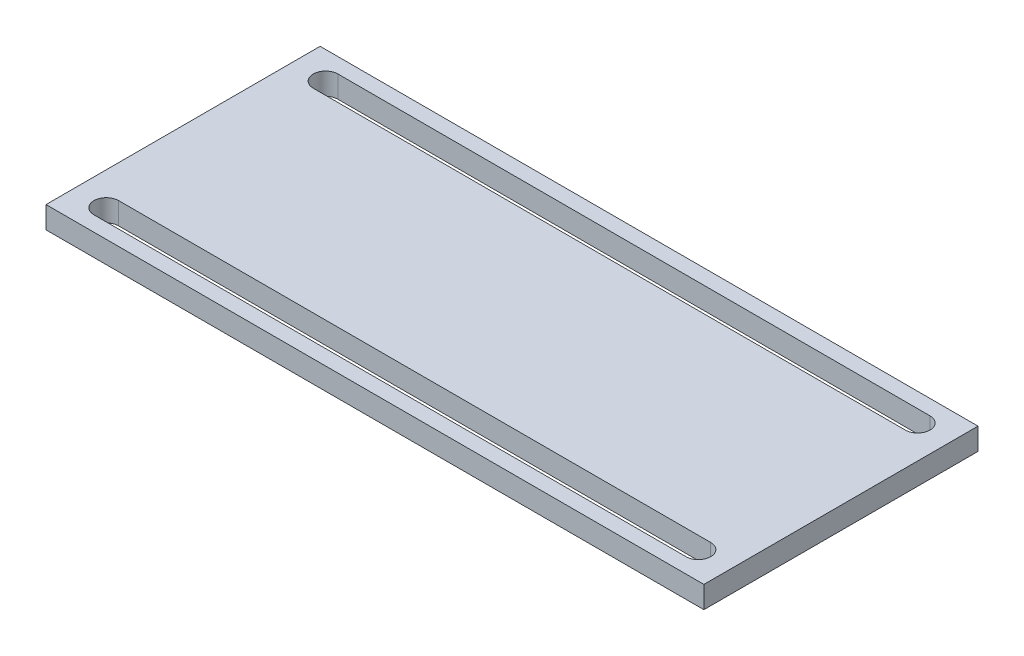
ISO-10303-21;
HEADER;
FILE_DESCRIPTION(('STEP AP214'),'2;1');
FILE_NAME('part.step','',(''),(''),'','','');
FILE_SCHEMA(('AUTOMOTIVE_DESIGN { 1 0 10303 214 1 1 1 1 }'));
ENDSEC;
DATA;
#1=APPLICATION_CONTEXT('core data for automotive mechanical design processes');
#2=APPLICATION_PROTOCOL_DEFINITION('international standard','automotive_design',2000,#1);
#3=PRODUCT_CONTEXT('',#1,'mechanical');
#4=PRODUCT('Part','Part','',(#3));
#5=PRODUCT_RELATED_PRODUCT_CATEGORY('part','',(#4));
#6=PRODUCT_DEFINITION_FORMATION('','',#4);
#7=PRODUCT_DEFINITION_CONTEXT('part definition',#1,'design');
#8=PRODUCT_DEFINITION('design','',#6,#7);
#9=PRODUCT_DEFINITION_SHAPE('','',#8);
#10=(LENGTH_UNIT() NAMED_UNIT(*) SI_UNIT(.MILLI.,.METRE.));
#11=(NAMED_UNIT(*) PLANE_ANGLE_UNIT() SI_UNIT($,.RADIAN.));
#12=(NAMED_UNIT(*) SI_UNIT($,.STERADIAN.) SOLID_ANGLE_UNIT());
#13=UNCERTAINTY_MEASURE_WITH_UNIT(LENGTH_MEASURE(1.E-05),#10,'distance_accuracy_value','');
#14=(GEOMETRIC_REPRESENTATION_CONTEXT(3) GLOBAL_UNCERTAINTY_ASSIGNED_CONTEXT((#13)) GLOBAL_UNIT_ASSIGNED_CONTEXT((#10,
#11,#12)) REPRESENTATION_CONTEXT('',''));
#15=CARTESIAN_POINT('',(0.,0.,0.));
#16=DIRECTION('',(0.,0.,1.));
#17=DIRECTION('',(1.,0.,0.));
#18=AXIS2_PLACEMENT_3D('',#15,#16,#17);
#19=CARTESIAN_POINT('',(60.,4.,25.));
#20=DIRECTION('',(-1.,0.,0.));
#21=DIRECTION('',(0.,0.,1.));
#22=AXIS2_PLACEMENT_3D('',#19,#20,#21);
#23=PLANE('',#22);
#24=DIRECTION('',(0.,0.,-1.));
#25=VECTOR('',#24,1.);
#26=CARTESIAN_POINT('',(60.,0.,25.));
#27=LINE('',#26,#25);
#28=CARTESIAN_POINT('',(60.,0.,25.));
#29=VERTEX_POINT('',#28);
#30=CARTESIAN_POINT('',(60.,0.,-25.));
#31=VERTEX_POINT('',#30);
#32=EDGE_CURVE('E174',#29,#31,#27,.T.);
#33=ORIENTED_EDGE('',*,*,#32,.T.);
#34=DIRECTION('',(0.,-1.,0.));
#35=VECTOR('',#34,1.);
#36=CARTESIAN_POINT('',(60.,4.,-25.));
#37=LINE('',#36,#35);
#38=CARTESIAN_POINT('',(60.,4.,-25.));
#39=VERTEX_POINT('',#38);
#40=EDGE_CURVE('E11',#39,#31,#37,.T.);
#41=ORIENTED_EDGE('',*,*,#40,.F.);
#42=DIRECTION('',(0.,0.,-1.));
#43=VECTOR('',#42,1.);
#44=CARTESIAN_POINT('',(60.,4.,25.));
#45=LINE('',#44,#43);
#46=CARTESIAN_POINT('',(60.,4.,25.));
#47=VERTEX_POINT('',#46);
#48=EDGE_CURVE('E221',#47,#39,#45,.T.);
#49=ORIENTED_EDGE('',*,*,#48,.F.);
#50=DIRECTION('',(0.,-1.,0.));
#51=VECTOR('',#50,1.);
#52=CARTESIAN_POINT('',(60.,4.,25.));
#53=LINE('',#52,#51);
#54=EDGE_CURVE('E235',#47,#29,#53,.T.);
#55=ORIENTED_EDGE('',*,*,#54,.T.);
#56=EDGE_LOOP('',(#33,#41,#49,#55));
#57=FACE_BOUND('',#56,.T.);
#58=ADVANCED_FACE('F38',(#57),#23,.F.);
#59=CARTESIAN_POINT('',(-60.,4.,-25.));
#60=DIRECTION('',(0.,0.,1.));
#61=DIRECTION('',(1.,0.,0.));
#62=AXIS2_PLACEMENT_3D('',#59,#60,#61);
#63=PLANE('',#62);
#64=DIRECTION('',(-1.,0.,0.));
#65=VECTOR('',#64,1.);
#66=CARTESIAN_POINT('',(-60.,0.,-25.));
#67=LINE('',#66,#65);
#68=CARTESIAN_POINT('',(-60.,0.,-25.));
#69=VERTEX_POINT('',#68);
#70=EDGE_CURVE('E239',#31,#69,#67,.T.);
#71=ORIENTED_EDGE('',*,*,#70,.T.);
#72=DIRECTION('',(0.,-1.,0.));
#73=VECTOR('',#72,1.);
#74=CARTESIAN_POINT('',(-60.,4.,-25.));
#75=LINE('',#74,#73);
#76=CARTESIAN_POINT('',(-60.,4.,-25.));
#77=VERTEX_POINT('',#76);
#78=EDGE_CURVE('E46',#77,#69,#75,.T.);
#79=ORIENTED_EDGE('',*,*,#78,.F.);
#80=DIRECTION('',(-1.,0.,0.));
#81=VECTOR('',#80,1.);
#82=CARTESIAN_POINT('',(-60.,4.,-25.));
#83=LINE('',#82,#81);
#84=EDGE_CURVE('E225',#39,#77,#83,.T.);
#85=ORIENTED_EDGE('',*,*,#84,.F.);
#86=ORIENTED_EDGE('',*,*,#40,.T.);
#87=EDGE_LOOP('',(#71,#79,#85,#86));
#88=FACE_BOUND('',#87,.T.);
#89=ADVANCED_FACE('F274',(#88),#63,.F.);
#90=CARTESIAN_POINT('',(-60.,4.,25.));
#91=DIRECTION('',(1.,0.,0.));
#92=DIRECTION('',(0.,0.,-1.));
#93=AXIS2_PLACEMENT_3D('',#90,#91,#92);
#94=PLANE('',#93);
#95=DIRECTION('',(0.,0.,1.));
#96=VECTOR('',#95,1.);
#97=CARTESIAN_POINT('',(-60.,0.,25.));
#98=LINE('',#97,#96);
#99=CARTESIAN_POINT('',(-60.,0.,25.));
#100=VERTEX_POINT('',#99);
#101=EDGE_CURVE('E242',#69,#100,#98,.T.);
#102=ORIENTED_EDGE('',*,*,#101,.T.);
#103=DIRECTION('',(0.,-1.,0.));
#104=VECTOR('',#103,1.);
#105=CARTESIAN_POINT('',(-60.,4.,25.));
#106=LINE('',#105,#104);
#107=CARTESIAN_POINT('',(-60.,4.,25.));
#108=VERTEX_POINT('',#107);
#109=EDGE_CURVE('E250',#108,#100,#106,.T.);
#110=ORIENTED_EDGE('',*,*,#109,.F.);
#111=DIRECTION('',(0.,0.,1.));
#112=VECTOR('',#111,1.);
#113=CARTESIAN_POINT('',(-60.,4.,25.));
#114=LINE('',#113,#112);
#115=EDGE_CURVE('E229',#77,#108,#114,.T.);
#116=ORIENTED_EDGE('',*,*,#115,.F.);
#117=ORIENTED_EDGE('',*,*,#78,.T.);
#118=EDGE_LOOP('',(#102,#110,#116,#117));
#119=FACE_BOUND('',#118,.T.);
#120=ADVANCED_FACE('F259',(#119),#94,.F.);
#121=CARTESIAN_POINT('',(-60.,4.,25.));
#122=DIRECTION('',(0.,0.,-1.));
#123=DIRECTION('',(-1.,0.,0.));
#124=AXIS2_PLACEMENT_3D('',#121,#122,#123);
#125=PLANE('',#124);
#126=DIRECTION('',(1.,0.,0.));
#127=VECTOR('',#126,1.);
#128=CARTESIAN_POINT('',(-60.,0.,25.));
#129=LINE('',#128,#127);
#130=EDGE_CURVE('E226',#100,#29,#129,.T.);
#131=ORIENTED_EDGE('',*,*,#130,.T.);
#132=ORIENTED_EDGE('',*,*,#54,.F.);
#133=DIRECTION('',(1.,0.,0.));
#134=VECTOR('',#133,1.);
#135=CARTESIAN_POINT('',(-60.,4.,25.));
#136=LINE('',#135,#134);
#137=EDGE_CURVE('E232',#108,#47,#136,.T.);
#138=ORIENTED_EDGE('',*,*,#137,.F.);
#139=ORIENTED_EDGE('',*,*,#109,.T.);
#140=EDGE_LOOP('',(#131,#132,#138,#139));
#141=FACE_BOUND('',#140,.T.);
#142=ADVANCED_FACE('F267',(#141),#125,.F.);
#143=CARTESIAN_POINT('',(0.,4.,0.));
#144=DIRECTION('',(0.,-1.,0.));
#145=DIRECTION('',(0.,0.,-1.));
#146=AXIS2_PLACEMENT_3D('',#143,#144,#145);
#147=PLANE('',#146);
#148=DIRECTION('',(1.,0.,0.));
#149=VECTOR('',#148,1.);
#150=CARTESIAN_POINT('',(-54.,4.,-17.75));
#151=LINE('',#150,#149);
#152=CARTESIAN_POINT('',(-54.,4.,-17.75));
#153=VERTEX_POINT('',#152);
#154=CARTESIAN_POINT('',(54.,4.,-17.75));
#155=VERTEX_POINT('',#154);
#156=EDGE_CURVE('E164',#153,#155,#151,.T.);
#157=ORIENTED_EDGE('',*,*,#156,.F.);
#158=CARTESIAN_POINT('',(-54.,4.,-20.));
#159=DIRECTION('',(0.,1.,0.));
#160=DIRECTION('',(0.,0.,1.));
#161=AXIS2_PLACEMENT_3D('',#158,#159,#160);
#162=CIRCLE('',#161,2.25);
#163=CARTESIAN_POINT('',(-54.,4.,-22.25));
#164=VERTEX_POINT('',#163);
#165=EDGE_CURVE('E53',#164,#153,#162,.T.);
#166=ORIENTED_EDGE('',*,*,#165,.F.);
#167=DIRECTION('',(-1.,0.,0.));
#168=VECTOR('',#167,1.);
#169=CARTESIAN_POINT('',(-54.,4.,-22.25));
#170=LINE('',#169,#168);
#171=CARTESIAN_POINT('',(54.,4.,-22.25));
#172=VERTEX_POINT('',#171);
#173=EDGE_CURVE('E151',#172,#164,#170,.T.);
#174=ORIENTED_EDGE('',*,*,#173,.F.);
#175=CARTESIAN_POINT('',(54.,4.,-20.));
#176=DIRECTION('',(0.,1.,0.));
#177=DIRECTION('',(0.,0.,1.));
#178=AXIS2_PLACEMENT_3D('',#175,#176,#177);
#179=CIRCLE('',#178,2.25);
#180=EDGE_CURVE('E155',#155,#172,#179,.T.);
#181=ORIENTED_EDGE('',*,*,#180,.F.);
#182=EDGE_LOOP('',(#157,#166,#174,#181));
#183=FACE_BOUND('',#182,.T.);
#184=DIRECTION('',(1.,0.,0.));
#185=VECTOR('',#184,1.);
#186=CARTESIAN_POINT('',(-54.,4.,22.25));
#187=LINE('',#186,#185);
#188=CARTESIAN_POINT('',(-54.,4.,22.25));
#189=VERTEX_POINT('',#188);
#190=CARTESIAN_POINT('',(54.,4.,22.25));
#191=VERTEX_POINT('',#190);
#192=EDGE_CURVE('E200',#189,#191,#187,.T.);
#193=ORIENTED_EDGE('',*,*,#192,.F.);
#194=CARTESIAN_POINT('',(-54.,4.,20.));
#195=DIRECTION('',(0.,1.,0.));
#196=DIRECTION('',(0.,0.,1.));
#197=AXIS2_PLACEMENT_3D('',#194,#195,#196);
#198=CIRCLE('',#197,2.25);
#199=CARTESIAN_POINT('',(-54.,4.,17.75));
#200=VERTEX_POINT('',#199);
#201=EDGE_CURVE('E61',#200,#189,#198,.T.);
#202=ORIENTED_EDGE('',*,*,#201,.F.);
#203=DIRECTION('',(-1.,0.,0.));
#204=VECTOR('',#203,1.);
#205=CARTESIAN_POINT('',(-54.,4.,17.75));
#206=LINE('',#205,#204);
#207=CARTESIAN_POINT('',(54.,4.,17.75));
#208=VERTEX_POINT('',#207);
#209=EDGE_CURVE('E185',#208,#200,#206,.T.);
#210=ORIENTED_EDGE('',*,*,#209,.F.);
#211=CARTESIAN_POINT('',(54.,4.,20.));
#212=DIRECTION('',(0.,1.,0.));
#213=DIRECTION('',(0.,0.,1.));
#214=AXIS2_PLACEMENT_3D('',#211,#212,#213);
#215=CIRCLE('',#214,2.25);
#216=EDGE_CURVE('E204',#191,#208,#215,.T.);
#217=ORIENTED_EDGE('',*,*,#216,.F.);
#218=EDGE_LOOP('',(#193,#202,#210,#217));
#219=FACE_BOUND('',#218,.T.);
#220=ORIENTED_EDGE('',*,*,#48,.T.);
#221=ORIENTED_EDGE('',*,*,#84,.T.);
#222=ORIENTED_EDGE('',*,*,#115,.T.);
#223=ORIENTED_EDGE('',*,*,#137,.T.);
#224=EDGE_LOOP('',(#220,#221,#222,#223));
#225=FACE_BOUND('',#224,.T.);
#226=ADVANCED_FACE('F273',(#183,#219,#225),#147,.F.);
#227=CARTESIAN_POINT('',(0.,0.,0.));
#228=DIRECTION('',(0.,-1.,0.));
#229=DIRECTION('',(0.,0.,-1.));
#230=AXIS2_PLACEMENT_3D('',#227,#228,#229);
#231=PLANE('',#230);
#232=CARTESIAN_POINT('',(-54.,0.,-20.));
#233=DIRECTION('',(0.,1.,0.));
#234=DIRECTION('',(0.,0.,1.));
#235=AXIS2_PLACEMENT_3D('',#232,#233,#234);
#236=CIRCLE('',#235,2.25);
#237=CARTESIAN_POINT('',(-54.,0.,-22.25));
#238=VERTEX_POINT('',#237);
#239=CARTESIAN_POINT('',(-54.,0.,-17.75));
#240=VERTEX_POINT('',#239);
#241=EDGE_CURVE('E129',#238,#240,#236,.T.);
#242=ORIENTED_EDGE('',*,*,#241,.T.);
#243=DIRECTION('',(1.,0.,0.));
#244=VECTOR('',#243,1.);
#245=CARTESIAN_POINT('',(-54.,0.,-17.75));
#246=LINE('',#245,#244);
#247=CARTESIAN_POINT('',(54.,0.,-17.75));
#248=VERTEX_POINT('',#247);
#249=EDGE_CURVE('E140',#240,#248,#246,.T.);
#250=ORIENTED_EDGE('',*,*,#249,.T.);
#251=CARTESIAN_POINT('',(54.,0.,-20.));
#252=DIRECTION('',(0.,1.,0.));
#253=DIRECTION('',(0.,0.,1.));
#254=AXIS2_PLACEMENT_3D('',#251,#252,#253);
#255=CIRCLE('',#254,2.25);
#256=CARTESIAN_POINT('',(54.,0.,-22.25));
#257=VERTEX_POINT('',#256);
#258=EDGE_CURVE('E145',#248,#257,#255,.T.);
#259=ORIENTED_EDGE('',*,*,#258,.T.);
#260=DIRECTION('',(-1.,0.,0.));
#261=VECTOR('',#260,1.);
#262=CARTESIAN_POINT('',(-54.,0.,-22.25));
#263=LINE('',#262,#261);
#264=EDGE_CURVE('E136',#257,#238,#263,.T.);
#265=ORIENTED_EDGE('',*,*,#264,.T.);
#266=EDGE_LOOP('',(#242,#250,#259,#265));
#267=FACE_BOUND('',#266,.T.);
#268=CARTESIAN_POINT('',(-54.,0.,20.));
#269=DIRECTION('',(0.,1.,0.));
#270=DIRECTION('',(0.,0.,1.));
#271=AXIS2_PLACEMENT_3D('',#268,#269,#270);
#272=CIRCLE('',#271,2.25);
#273=CARTESIAN_POINT('',(-54.,0.,17.75));
#274=VERTEX_POINT('',#273);
#275=CARTESIAN_POINT('',(-54.,0.,22.25));
#276=VERTEX_POINT('',#275);
#277=EDGE_CURVE('E180',#274,#276,#272,.T.);
#278=ORIENTED_EDGE('',*,*,#277,.T.);
#279=DIRECTION('',(1.,0.,0.));
#280=VECTOR('',#279,1.);
#281=CARTESIAN_POINT('',(-54.,0.,22.25));
#282=LINE('',#281,#280);
#283=CARTESIAN_POINT('',(54.,0.,22.25));
#284=VERTEX_POINT('',#283);
#285=EDGE_CURVE('E184',#276,#284,#282,.T.);
#286=ORIENTED_EDGE('',*,*,#285,.T.);
#287=CARTESIAN_POINT('',(54.,0.,20.));
#288=DIRECTION('',(0.,1.,0.));
#289=DIRECTION('',(0.,0.,1.));
#290=AXIS2_PLACEMENT_3D('',#287,#288,#289);
#291=CIRCLE('',#290,2.25);
#292=CARTESIAN_POINT('',(54.,0.,17.75));
#293=VERTEX_POINT('',#292);
#294=EDGE_CURVE('E189',#284,#293,#291,.T.);
#295=ORIENTED_EDGE('',*,*,#294,.T.);
#296=DIRECTION('',(-1.,0.,0.));
#297=VECTOR('',#296,1.);
#298=CARTESIAN_POINT('',(-54.,0.,17.75));
#299=LINE('',#298,#297);
#300=EDGE_CURVE('E193',#293,#274,#299,.T.);
#301=ORIENTED_EDGE('',*,*,#300,.T.);
#302=EDGE_LOOP('',(#278,#286,#295,#301));
#303=FACE_BOUND('',#302,.T.);
#304=ORIENTED_EDGE('',*,*,#32,.F.);
#305=ORIENTED_EDGE('',*,*,#130,.F.);
#306=ORIENTED_EDGE('',*,*,#101,.F.);
#307=ORIENTED_EDGE('',*,*,#70,.F.);
#308=EDGE_LOOP('',(#304,#305,#306,#307));
#309=FACE_BOUND('',#308,.T.);
#310=ADVANCED_FACE('F147',(#267,#303,#309),#231,.T.);
#311=CARTESIAN_POINT('',(-54.,0.,20.));
#312=DIRECTION('',(0.,1.,0.));
#313=DIRECTION('',(0.,0.,1.));
#314=AXIS2_PLACEMENT_3D('',#311,#312,#313);
#315=CYLINDRICAL_SURFACE('',#314,2.25);
#316=ORIENTED_EDGE('',*,*,#201,.T.);
#317=DIRECTION('',(0.,1.,0.));
#318=VECTOR('',#317,1.);
#319=CARTESIAN_POINT('',(-54.,0.,22.25));
#320=LINE('',#319,#318);
#321=EDGE_CURVE('E197',#276,#189,#320,.T.);
#322=ORIENTED_EDGE('',*,*,#321,.F.);
#323=ORIENTED_EDGE('',*,*,#277,.F.);
#324=DIRECTION('',(0.,1.,0.));
#325=VECTOR('',#324,1.);
#326=CARTESIAN_POINT('',(-54.,0.,17.75));
#327=LINE('',#326,#325);
#328=EDGE_CURVE('E165',#274,#200,#327,.T.);
#329=ORIENTED_EDGE('',*,*,#328,.T.);
#330=EDGE_LOOP('',(#316,#322,#323,#329));
#331=FACE_BOUND('',#330,.T.);
#332=ADVANCED_FACE('F286',(#331),#315,.F.);
#333=CARTESIAN_POINT('',(-54.,0.,17.75));
#334=DIRECTION('',(0.,0.,-1.));
#335=DIRECTION('',(-1.,0.,0.));
#336=AXIS2_PLACEMENT_3D('',#333,#334,#335);
#337=PLANE('',#336);
#338=ORIENTED_EDGE('',*,*,#209,.T.);
#339=ORIENTED_EDGE('',*,*,#328,.F.);
#340=ORIENTED_EDGE('',*,*,#300,.F.);
#341=DIRECTION('',(0.,1.,0.));
#342=VECTOR('',#341,1.);
#343=CARTESIAN_POINT('',(54.,0.,17.75));
#344=LINE('',#343,#342);
#345=EDGE_CURVE('E213',#293,#208,#344,.T.);
#346=ORIENTED_EDGE('',*,*,#345,.T.);
#347=EDGE_LOOP('',(#338,#339,#340,#346));
#348=FACE_BOUND('',#347,.T.);
#349=ADVANCED_FACE('F292',(#348),#337,.F.);
#350=CARTESIAN_POINT('',(54.,0.,20.));
#351=DIRECTION('',(0.,1.,0.));
#352=DIRECTION('',(0.,0.,1.));
#353=AXIS2_PLACEMENT_3D('',#350,#351,#352);
#354=CYLINDRICAL_SURFACE('',#353,2.25);
#355=ORIENTED_EDGE('',*,*,#216,.T.);
#356=ORIENTED_EDGE('',*,*,#345,.F.);
#357=ORIENTED_EDGE('',*,*,#294,.F.);
#358=DIRECTION('',(0.,1.,0.));
#359=VECTOR('',#358,1.);
#360=CARTESIAN_POINT('',(54.,0.,22.25));
#361=LINE('',#360,#359);
#362=EDGE_CURVE('E216',#284,#191,#361,.T.);
#363=ORIENTED_EDGE('',*,*,#362,.T.);
#364=EDGE_LOOP('',(#355,#356,#357,#363));
#365=FACE_BOUND('',#364,.T.);
#366=ADVANCED_FACE('F296',(#365),#354,.F.);
#367=CARTESIAN_POINT('',(-54.,0.,22.25));
#368=DIRECTION('',(0.,0.,1.));
#369=DIRECTION('',(1.,0.,0.));
#370=AXIS2_PLACEMENT_3D('',#367,#368,#369);
#371=PLANE('',#370);
#372=ORIENTED_EDGE('',*,*,#192,.T.);
#373=ORIENTED_EDGE('',*,*,#362,.F.);
#374=ORIENTED_EDGE('',*,*,#285,.F.);
#375=ORIENTED_EDGE('',*,*,#321,.T.);
#376=EDGE_LOOP('',(#372,#373,#374,#375));
#377=FACE_BOUND('',#376,.T.);
#378=ADVANCED_FACE('F293',(#377),#371,.F.);
#379=CARTESIAN_POINT('',(-54.,0.,-20.));
#380=DIRECTION('',(0.,1.,0.));
#381=DIRECTION('',(0.,0.,1.));
#382=AXIS2_PLACEMENT_3D('',#379,#380,#381);
#383=CYLINDRICAL_SURFACE('',#382,2.25);
#384=ORIENTED_EDGE('',*,*,#165,.T.);
#385=DIRECTION('',(0.,1.,0.));
#386=VECTOR('',#385,1.);
#387=CARTESIAN_POINT('',(-54.,0.,-17.75));
#388=LINE('',#387,#386);
#389=EDGE_CURVE('E125',#240,#153,#388,.T.);
#390=ORIENTED_EDGE('',*,*,#389,.F.);
#391=ORIENTED_EDGE('',*,*,#241,.F.);
#392=DIRECTION('',(0.,1.,0.));
#393=VECTOR('',#392,1.);
#394=CARTESIAN_POINT('',(-54.,0.,-22.25));
#395=LINE('',#394,#393);
#396=EDGE_CURVE('E171',#238,#164,#395,.T.);
#397=ORIENTED_EDGE('',*,*,#396,.T.);
#398=EDGE_LOOP('',(#384,#390,#391,#397));
#399=FACE_BOUND('',#398,.T.);
#400=ADVANCED_FACE('F127',(#399),#383,.F.);
#401=CARTESIAN_POINT('',(-54.,0.,-22.25));
#402=DIRECTION('',(0.,0.,-1.));
#403=DIRECTION('',(-1.,0.,0.));
#404=AXIS2_PLACEMENT_3D('',#401,#402,#403);
#405=PLANE('',#404);
#406=ORIENTED_EDGE('',*,*,#173,.T.);
#407=ORIENTED_EDGE('',*,*,#396,.F.);
#408=ORIENTED_EDGE('',*,*,#264,.F.);
#409=DIRECTION('',(0.,1.,0.));
#410=VECTOR('',#409,1.);
#411=CARTESIAN_POINT('',(54.,0.,-22.25));
#412=LINE('',#411,#410);
#413=EDGE_CURVE('E175',#257,#172,#412,.T.);
#414=ORIENTED_EDGE('',*,*,#413,.T.);
#415=EDGE_LOOP('',(#406,#407,#408,#414));
#416=FACE_BOUND('',#415,.T.);
#417=ADVANCED_FACE('F306',(#416),#405,.F.);
#418=CARTESIAN_POINT('',(54.,0.,-20.));
#419=DIRECTION('',(0.,1.,0.));
#420=DIRECTION('',(0.,0.,1.));
#421=AXIS2_PLACEMENT_3D('',#418,#419,#420);
#422=CYLINDRICAL_SURFACE('',#421,2.25);
#423=ORIENTED_EDGE('',*,*,#180,.T.);
#424=ORIENTED_EDGE('',*,*,#413,.F.);
#425=ORIENTED_EDGE('',*,*,#258,.F.);
#426=DIRECTION('',(0.,1.,0.));
#427=VECTOR('',#426,1.);
#428=CARTESIAN_POINT('',(54.,0.,-17.75));
#429=LINE('',#428,#427);
#430=EDGE_CURVE('E135',#248,#155,#429,.T.);
#431=ORIENTED_EDGE('',*,*,#430,.T.);
#432=EDGE_LOOP('',(#423,#424,#425,#431));
#433=FACE_BOUND('',#432,.T.);
#434=ADVANCED_FACE('F309',(#433),#422,.F.);
#435=CARTESIAN_POINT('',(-54.,0.,-17.75));
#436=DIRECTION('',(0.,0.,1.));
#437=DIRECTION('',(1.,0.,0.));
#438=AXIS2_PLACEMENT_3D('',#435,#436,#437);
#439=PLANE('',#438);
#440=ORIENTED_EDGE('',*,*,#156,.T.);
#441=ORIENTED_EDGE('',*,*,#430,.F.);
#442=ORIENTED_EDGE('',*,*,#249,.F.);
#443=ORIENTED_EDGE('',*,*,#389,.T.);
#444=EDGE_LOOP('',(#440,#441,#442,#443));
#445=FACE_BOUND('',#444,.T.);
#446=ADVANCED_FACE('F141',(#445),#439,.F.);
#447=CLOSED_SHELL('',(#58,#89,#120,#142,#226,#310,#332,#349,#366,#378,#400,#417,#434,#446));
#448=MANIFOLD_SOLID_BREP('B2',#447);
#449=ADVANCED_BREP_SHAPE_REPRESENTATION('',(#18,#448),#14);
#450=SHAPE_DEFINITION_REPRESENTATION(#9,#449);
ENDSEC;
END-ISO-10303-21;
